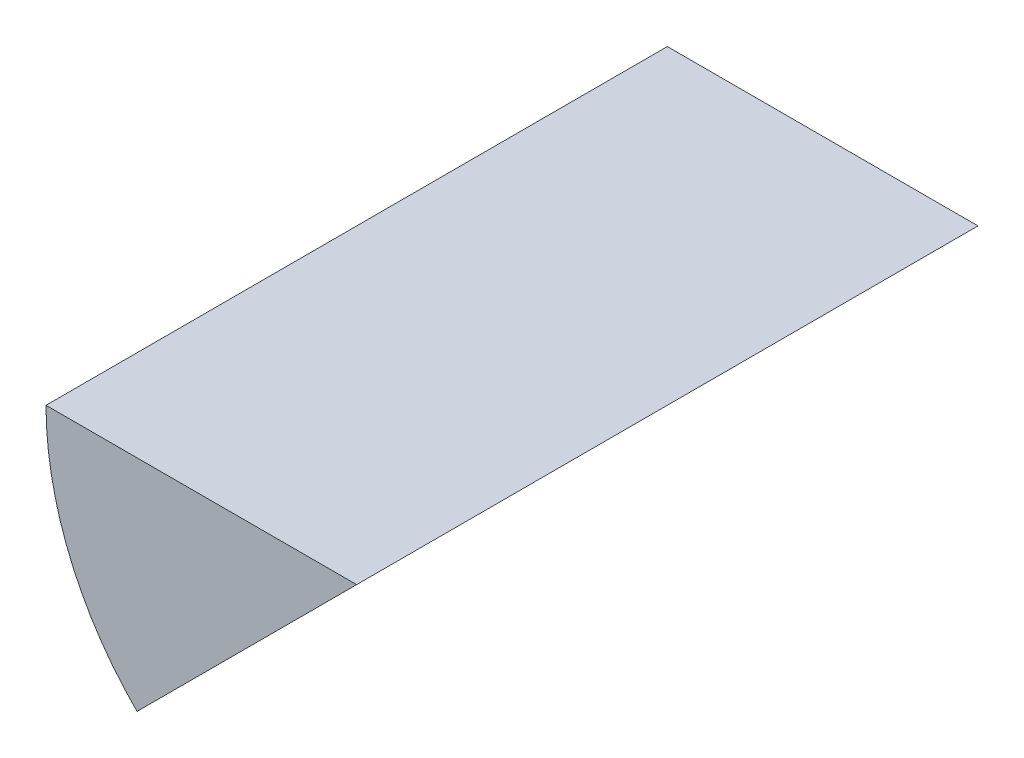
ISO-10303-21;
HEADER;
FILE_DESCRIPTION(('STEP AP214'),'2;1');
FILE_NAME('part.step','',(''),(''),'','','');
FILE_SCHEMA(('AUTOMOTIVE_DESIGN { 1 0 10303 214 1 1 1 1 }'));
ENDSEC;
DATA;
#1=APPLICATION_CONTEXT('core data for automotive mechanical design processes');
#2=APPLICATION_PROTOCOL_DEFINITION('international standard','automotive_design',2000,#1);
#3=PRODUCT_CONTEXT('',#1,'mechanical');
#4=PRODUCT('Part','Part','',(#3));
#5=PRODUCT_RELATED_PRODUCT_CATEGORY('part','',(#4));
#6=PRODUCT_DEFINITION_FORMATION('','',#4);
#7=PRODUCT_DEFINITION_CONTEXT('part definition',#1,'design');
#8=PRODUCT_DEFINITION('design','',#6,#7);
#9=PRODUCT_DEFINITION_SHAPE('','',#8);
#10=(LENGTH_UNIT() NAMED_UNIT(*) SI_UNIT(.MILLI.,.METRE.));
#11=(NAMED_UNIT(*) PLANE_ANGLE_UNIT() SI_UNIT($,.RADIAN.));
#12=(NAMED_UNIT(*) SI_UNIT($,.STERADIAN.) SOLID_ANGLE_UNIT());
#13=UNCERTAINTY_MEASURE_WITH_UNIT(LENGTH_MEASURE(1.E-05),#10,'distance_accuracy_value','');
#14=(GEOMETRIC_REPRESENTATION_CONTEXT(3) GLOBAL_UNCERTAINTY_ASSIGNED_CONTEXT((#13)) GLOBAL_UNIT_ASSIGNED_CONTEXT((#10,
#11,#12)) REPRESENTATION_CONTEXT('',''));
#15=CARTESIAN_POINT('',(0.,0.,0.));
#16=DIRECTION('',(0.,0.,1.));
#17=DIRECTION('',(1.,0.,0.));
#18=AXIS2_PLACEMENT_3D('',#15,#16,#17);
#19=CARTESIAN_POINT('',(0.,0.,50.));
#20=DIRECTION('',(-0.707106781186554,0.707106781186541,0.));
#21=DIRECTION('',(-0.707106781186541,-0.707106781186554,0.));
#22=AXIS2_PLACEMENT_3D('',#19,#20,#21);
#23=PLANE('',#22);
#24=DIRECTION('',(0.707106781186541,0.707106781186554,0.));
#25=VECTOR('',#24,1.);
#26=CARTESIAN_POINT('',(0.,0.,0.));
#27=LINE('',#26,#25);
#28=CARTESIAN_POINT('',(-17.6776695296635,-17.6776695296638,0.));
#29=VERTEX_POINT('',#28);
#30=CARTESIAN_POINT('',(0.,0.,0.));
#31=VERTEX_POINT('',#30);
#32=EDGE_CURVE('E80',#29,#31,#27,.T.);
#33=ORIENTED_EDGE('',*,*,#32,.T.);
#34=DIRECTION('',(0.,0.,-1.));
#35=VECTOR('',#34,1.);
#36=CARTESIAN_POINT('',(0.,0.,50.));
#37=LINE('',#36,#35);
#38=CARTESIAN_POINT('',(0.,0.,50.));
#39=VERTEX_POINT('',#38);
#40=EDGE_CURVE('E11',#39,#31,#37,.T.);
#41=ORIENTED_EDGE('',*,*,#40,.F.);
#42=DIRECTION('',(0.707106781186541,0.707106781186554,0.));
#43=VECTOR('',#42,1.);
#44=CARTESIAN_POINT('',(0.,0.,50.));
#45=LINE('',#44,#43);
#46=CARTESIAN_POINT('',(-17.6776695296635,-17.6776695296638,50.));
#47=VERTEX_POINT('',#46);
#48=EDGE_CURVE('E73',#47,#39,#45,.T.);
#49=ORIENTED_EDGE('',*,*,#48,.F.);
#50=DIRECTION('',(0.,0.,-1.));
#51=VECTOR('',#50,1.);
#52=CARTESIAN_POINT('',(-17.6776695296635,-17.6776695296638,50.));
#53=LINE('',#52,#51);
#54=EDGE_CURVE('E81',#47,#29,#53,.T.);
#55=ORIENTED_EDGE('',*,*,#54,.T.);
#56=EDGE_LOOP('',(#33,#41,#49,#55));
#57=FACE_BOUND('',#56,.T.);
#58=ADVANCED_FACE('F33',(#57),#23,.F.);
#59=CARTESIAN_POINT('',(0.,0.,50.));
#60=DIRECTION('',(0.,-1.,0.));
#61=DIRECTION('',(0.,0.,-1.));
#62=AXIS2_PLACEMENT_3D('',#59,#60,#61);
#63=PLANE('',#62);
#64=DIRECTION('',(-1.,0.,0.));
#65=VECTOR('',#64,1.);
#66=CARTESIAN_POINT('',(0.,0.,0.));
#67=LINE('',#66,#65);
#68=CARTESIAN_POINT('',(-25.,0.,0.));
#69=VERTEX_POINT('',#68);
#70=EDGE_CURVE('E61',#31,#69,#67,.T.);
#71=ORIENTED_EDGE('',*,*,#70,.T.);
#72=DIRECTION('',(0.,0.,-1.));
#73=VECTOR('',#72,1.);
#74=CARTESIAN_POINT('',(-25.,0.,50.));
#75=LINE('',#74,#73);
#76=CARTESIAN_POINT('',(-25.,0.,50.));
#77=VERTEX_POINT('',#76);
#78=EDGE_CURVE('E41',#77,#69,#75,.T.);
#79=ORIENTED_EDGE('',*,*,#78,.F.);
#80=DIRECTION('',(-1.,0.,0.));
#81=VECTOR('',#80,1.);
#82=CARTESIAN_POINT('',(0.,0.,50.));
#83=LINE('',#82,#81);
#84=EDGE_CURVE('E69',#39,#77,#83,.T.);
#85=ORIENTED_EDGE('',*,*,#84,.F.);
#86=ORIENTED_EDGE('',*,*,#40,.T.);
#87=EDGE_LOOP('',(#71,#79,#85,#86));
#88=FACE_BOUND('',#87,.T.);
#89=ADVANCED_FACE('F70',(#88),#63,.F.);
#90=CARTESIAN_POINT('',(0.,0.,50.));
#91=DIRECTION('',(0.,0.,-1.));
#92=DIRECTION('',(-1.,0.,0.));
#93=AXIS2_PLACEMENT_3D('',#90,#91,#92);
#94=CYLINDRICAL_SURFACE('',#93,25.);
#95=CARTESIAN_POINT('',(0.,0.,0.));
#96=DIRECTION('',(0.,0.,1.));
#97=DIRECTION('',(1.,0.,0.));
#98=AXIS2_PLACEMENT_3D('',#95,#96,#97);
#99=CIRCLE('',#98,25.);
#100=EDGE_CURVE('E66',#69,#29,#99,.T.);
#101=ORIENTED_EDGE('',*,*,#100,.T.);
#102=ORIENTED_EDGE('',*,*,#54,.F.);
#103=CARTESIAN_POINT('',(0.,0.,50.));
#104=DIRECTION('',(0.,0.,1.));
#105=DIRECTION('',(1.,0.,0.));
#106=AXIS2_PLACEMENT_3D('',#103,#104,#105);
#107=CIRCLE('',#106,25.);
#108=EDGE_CURVE('E49',#77,#47,#107,.T.);
#109=ORIENTED_EDGE('',*,*,#108,.F.);
#110=ORIENTED_EDGE('',*,*,#78,.T.);
#111=EDGE_LOOP('',(#101,#102,#109,#110));
#112=FACE_BOUND('',#111,.T.);
#113=ADVANCED_FACE('F92',(#112),#94,.T.);
#114=CARTESIAN_POINT('',(0.,0.,50.));
#115=DIRECTION('',(0.,0.,1.));
#116=DIRECTION('',(1.,0.,0.));
#117=AXIS2_PLACEMENT_3D('',#114,#115,#116);
#118=PLANE('',#117);
#119=ORIENTED_EDGE('',*,*,#48,.T.);
#120=ORIENTED_EDGE('',*,*,#84,.T.);
#121=ORIENTED_EDGE('',*,*,#108,.T.);
#122=EDGE_LOOP('',(#119,#120,#121));
#123=FACE_BOUND('',#122,.T.);
#124=ADVANCED_FACE('F76',(#123),#118,.T.);
#125=CARTESIAN_POINT('',(0.,0.,0.));
#126=DIRECTION('',(0.,0.,1.));
#127=DIRECTION('',(1.,0.,0.));
#128=AXIS2_PLACEMENT_3D('',#125,#126,#127);
#129=PLANE('',#128);
#130=CARTESIAN_POINT('',(-16.1769120967879,-6.22810047621077,0.));
#131=DIRECTION('',(0.,0.,-1.));
#132=DIRECTION('',(-1.,0.,0.));
#133=AXIS2_PLACEMENT_3D('',#130,#131,#132);
#134=CIRCLE('',#133,5.);
#135=CARTESIAN_POINT('',(-21.1769120967879,-6.22810047621077,0.));
#136=VERTEX_POINT('',#135);
#137=EDGE_CURVE('E87',#136,#136,#134,.T.);
#138=ORIENTED_EDGE('',*,*,#137,.F.);
#139=EDGE_LOOP('',(#138));
#140=FACE_BOUND('',#139,.T.);
#141=ORIENTED_EDGE('',*,*,#32,.F.);
#142=ORIENTED_EDGE('',*,*,#100,.F.);
#143=ORIENTED_EDGE('',*,*,#70,.F.);
#144=EDGE_LOOP('',(#141,#142,#143));
#145=FACE_BOUND('',#144,.T.);
#146=ADVANCED_FACE('F93',(#140,#145),#129,.F.);
#147=CARTESIAN_POINT('',(-16.1769120967879,-6.22810047621077,10.));
#148=DIRECTION('',(0.,0.,-1.));
#149=DIRECTION('',(-1.,0.,0.));
#150=AXIS2_PLACEMENT_3D('',#147,#148,#149);
#151=CYLINDRICAL_SURFACE('',#150,5.);
#152=CARTESIAN_POINT('',(-16.1769120967879,-6.22810047621077,10.));
#153=DIRECTION('',(0.,0.,-1.));
#154=DIRECTION('',(-1.,0.,0.));
#155=AXIS2_PLACEMENT_3D('',#152,#153,#154);
#156=CIRCLE('',#155,5.);
#157=CARTESIAN_POINT('',(-21.1769120967879,-6.22810047621077,10.));
#158=VERTEX_POINT('',#157);
#159=EDGE_CURVE('E83',#158,#158,#156,.T.);
#160=ORIENTED_EDGE('',*,*,#159,.F.);
#161=EDGE_LOOP('',(#160));
#162=FACE_BOUND('',#161,.T.);
#163=ORIENTED_EDGE('',*,*,#137,.T.);
#164=EDGE_LOOP('',(#163));
#165=FACE_BOUND('',#164,.T.);
#166=ADVANCED_FACE('F95',(#162,#165),#151,.F.);
#167=CARTESIAN_POINT('',(-16.1769120967879,-6.22810047621077,10.));
#168=DIRECTION('',(0.,0.,-1.));
#169=DIRECTION('',(-1.,0.,0.));
#170=AXIS2_PLACEMENT_3D('',#167,#168,#169);
#171=PLANE('',#170);
#172=ORIENTED_EDGE('',*,*,#159,.T.);
#173=EDGE_LOOP('',(#172));
#174=FACE_BOUND('',#173,.T.);
#175=ADVANCED_FACE('F102',(#174),#171,.T.);
#176=CLOSED_SHELL('',(#58,#89,#113,#124,#146,#166,#175));
#177=MANIFOLD_SOLID_BREP('B2',#176);
#178=ADVANCED_BREP_SHAPE_REPRESENTATION('',(#18,#177),#14);
#179=SHAPE_DEFINITION_REPRESENTATION(#9,#178);
ENDSEC;
END-ISO-10303-21;
